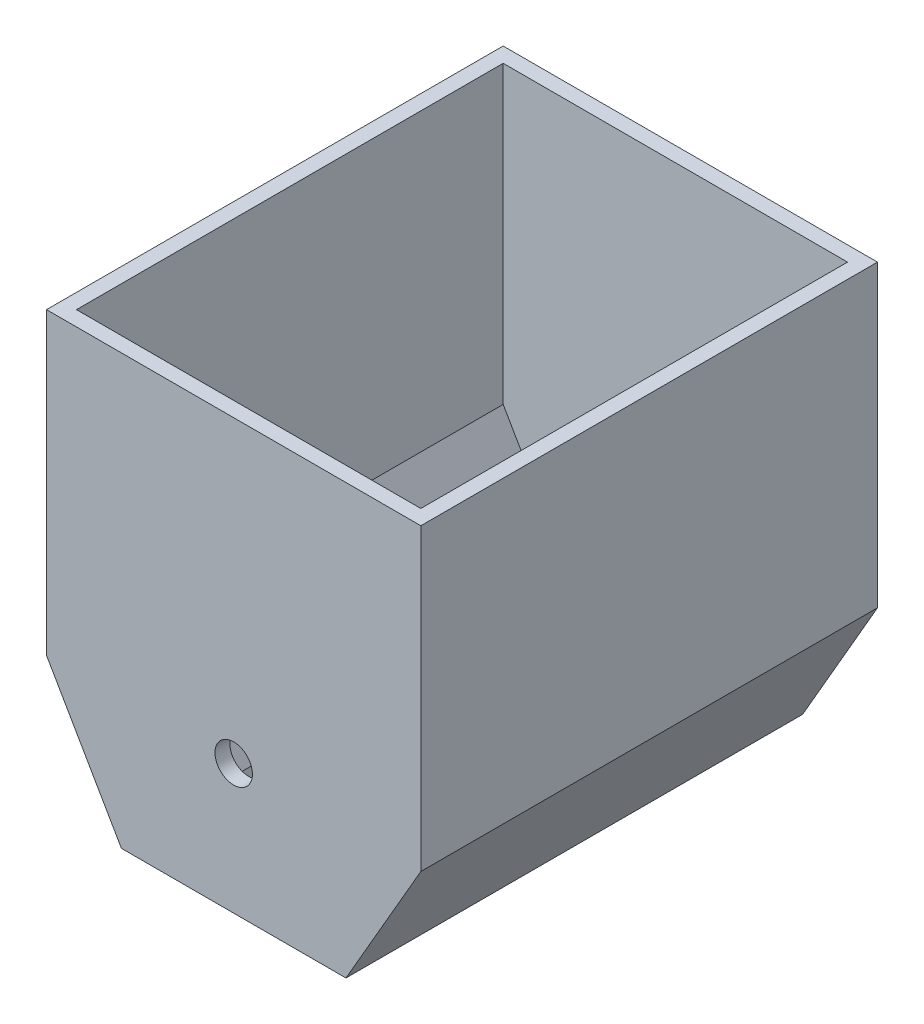
ISO-10303-21;
HEADER;
FILE_DESCRIPTION(('STEP AP214'),'2;1');
FILE_NAME('part.step','',(''),(''),'','','');
FILE_SCHEMA(('AUTOMOTIVE_DESIGN { 1 0 10303 214 1 1 1 1 }'));
ENDSEC;
DATA;
#1=APPLICATION_CONTEXT('core data for automotive mechanical design processes');
#2=APPLICATION_PROTOCOL_DEFINITION('international standard','automotive_design',2000,#1);
#3=PRODUCT_CONTEXT('',#1,'mechanical');
#4=PRODUCT('Part','Part','',(#3));
#5=PRODUCT_RELATED_PRODUCT_CATEGORY('part','',(#4));
#6=PRODUCT_DEFINITION_FORMATION('','',#4);
#7=PRODUCT_DEFINITION_CONTEXT('part definition',#1,'design');
#8=PRODUCT_DEFINITION('design','',#6,#7);
#9=PRODUCT_DEFINITION_SHAPE('','',#8);
#10=(LENGTH_UNIT() NAMED_UNIT(*) SI_UNIT(.MILLI.,.METRE.));
#11=(NAMED_UNIT(*) PLANE_ANGLE_UNIT() SI_UNIT($,.RADIAN.));
#12=(NAMED_UNIT(*) SI_UNIT($,.STERADIAN.) SOLID_ANGLE_UNIT());
#13=UNCERTAINTY_MEASURE_WITH_UNIT(LENGTH_MEASURE(1.E-05),#10,'distance_accuracy_value','');
#14=(GEOMETRIC_REPRESENTATION_CONTEXT(3) GLOBAL_UNCERTAINTY_ASSIGNED_CONTEXT((#13)) GLOBAL_UNIT_ASSIGNED_CONTEXT((#10,
#11,#12)) REPRESENTATION_CONTEXT('',''));
#15=CARTESIAN_POINT('',(0.,0.,0.));
#16=DIRECTION('',(0.,0.,1.));
#17=DIRECTION('',(1.,0.,0.));
#18=AXIS2_PLACEMENT_3D('',#15,#16,#17);
#19=CARTESIAN_POINT('',(31.75,72.7970452561247,38.735));
#20=DIRECTION('',(0.,-1.,0.));
#21=DIRECTION('',(0.,0.,-1.));
#22=AXIS2_PLACEMENT_3D('',#19,#20,#21);
#23=PLANE('',#22);
#24=DIRECTION('',(-1.,0.,0.));
#25=VECTOR('',#24,1.);
#26=CARTESIAN_POINT('',(31.75,72.7970452561247,-38.735));
#27=LINE('',#26,#25);
#28=CARTESIAN_POINT('',(31.75,72.7970452561247,-38.735));
#29=VERTEX_POINT('',#28);
#30=CARTESIAN_POINT('',(-31.75,72.7970452561247,-38.735));
#31=VERTEX_POINT('',#30);
#32=EDGE_CURVE('E229',#29,#31,#27,.T.);
#33=ORIENTED_EDGE('',*,*,#32,.T.);
#34=DIRECTION('',(0.,0.,-1.));
#35=VECTOR('',#34,1.);
#36=CARTESIAN_POINT('',(-31.75,72.7970452561247,38.735));
#37=LINE('',#36,#35);
#38=CARTESIAN_POINT('',(-31.75,72.7970452561247,38.735));
#39=VERTEX_POINT('',#38);
#40=EDGE_CURVE('E44',#39,#31,#37,.T.);
#41=ORIENTED_EDGE('',*,*,#40,.F.);
#42=DIRECTION('',(-1.,0.,0.));
#43=VECTOR('',#42,1.);
#44=CARTESIAN_POINT('',(31.75,72.7970452561247,38.735));
#45=LINE('',#44,#43);
#46=CARTESIAN_POINT('',(31.75,72.7970452561247,38.735));
#47=VERTEX_POINT('',#46);
#48=EDGE_CURVE('E215',#47,#39,#45,.T.);
#49=ORIENTED_EDGE('',*,*,#48,.F.);
#50=DIRECTION('',(0.,0.,-1.));
#51=VECTOR('',#50,1.);
#52=CARTESIAN_POINT('',(31.75,72.7970452561247,38.735));
#53=LINE('',#52,#51);
#54=EDGE_CURVE('E11',#47,#29,#53,.T.);
#55=ORIENTED_EDGE('',*,*,#54,.T.);
#56=EDGE_LOOP('',(#33,#41,#49,#55));
#57=FACE_BOUND('',#56,.T.);
#58=DIRECTION('',(-1.,0.,0.));
#59=VECTOR('',#58,1.);
#60=CARTESIAN_POINT('',(31.75,72.7970452561247,-36.195));
#61=LINE('',#60,#59);
#62=CARTESIAN_POINT('',(29.21,72.7970452561247,-36.195));
#63=VERTEX_POINT('',#62);
#64=CARTESIAN_POINT('',(-29.21,72.7970452561247,-36.195));
#65=VERTEX_POINT('',#64);
#66=EDGE_CURVE('E177',#63,#65,#61,.T.);
#67=ORIENTED_EDGE('',*,*,#66,.F.);
#68=DIRECTION('',(0.,0.,-1.));
#69=VECTOR('',#68,1.);
#70=CARTESIAN_POINT('',(29.21,72.7970452561247,38.735));
#71=LINE('',#70,#69);
#72=CARTESIAN_POINT('',(29.21,72.7970452561247,36.195));
#73=VERTEX_POINT('',#72);
#74=EDGE_CURVE('E204',#73,#63,#71,.T.);
#75=ORIENTED_EDGE('',*,*,#74,.F.);
#76=DIRECTION('',(-1.,0.,0.));
#77=VECTOR('',#76,1.);
#78=CARTESIAN_POINT('',(31.75,72.7970452561247,36.195));
#79=LINE('',#78,#77);
#80=CARTESIAN_POINT('',(-29.21,72.7970452561247,36.195));
#81=VERTEX_POINT('',#80);
#82=EDGE_CURVE('E179',#73,#81,#79,.T.);
#83=ORIENTED_EDGE('',*,*,#82,.T.);
#84=DIRECTION('',(0.,0.,-1.));
#85=VECTOR('',#84,1.);
#86=CARTESIAN_POINT('',(-29.21,72.7970452561247,38.735));
#87=LINE('',#86,#85);
#88=EDGE_CURVE('E201',#81,#65,#87,.T.);
#89=ORIENTED_EDGE('',*,*,#88,.T.);
#90=EDGE_LOOP('',(#67,#75,#83,#89));
#91=FACE_BOUND('',#90,.T.);
#92=ADVANCED_FACE('F35',(#57,#91),#23,.F.);
#93=CARTESIAN_POINT('',(31.75,21.9970452561247,38.735));
#94=DIRECTION('',(-1.,0.,0.));
#95=DIRECTION('',(0.,-1.,0.));
#96=AXIS2_PLACEMENT_3D('',#93,#94,#95);
#97=PLANE('',#96);
#98=DIRECTION('',(0.,1.,0.));
#99=VECTOR('',#98,1.);
#100=CARTESIAN_POINT('',(31.75,21.9970452561247,-38.735));
#101=LINE('',#100,#99);
#102=CARTESIAN_POINT('',(31.75,21.9970452561247,-38.735));
#103=VERTEX_POINT('',#102);
#104=EDGE_CURVE('E206',#103,#29,#101,.T.);
#105=ORIENTED_EDGE('',*,*,#104,.T.);
#106=ORIENTED_EDGE('',*,*,#54,.F.);
#107=DIRECTION('',(0.,1.,0.));
#108=VECTOR('',#107,1.);
#109=CARTESIAN_POINT('',(31.75,21.9970452561247,38.735));
#110=LINE('',#109,#108);
#111=CARTESIAN_POINT('',(31.75,21.9970452561247,38.735));
#112=VERTEX_POINT('',#111);
#113=EDGE_CURVE('E212',#112,#47,#110,.T.);
#114=ORIENTED_EDGE('',*,*,#113,.F.);
#115=DIRECTION('',(0.,0.,-1.));
#116=VECTOR('',#115,1.);
#117=CARTESIAN_POINT('',(31.75,21.9970452561247,38.735));
#118=LINE('',#117,#116);
#119=EDGE_CURVE('E226',#112,#103,#118,.T.);
#120=ORIENTED_EDGE('',*,*,#119,.T.);
#121=EDGE_LOOP('',(#105,#106,#114,#120));
#122=FACE_BOUND('',#121,.T.);
#123=ADVANCED_FACE('F37',(#122),#97,.F.);
#124=CARTESIAN_POINT('',(-31.75,72.7970452561247,38.735));
#125=DIRECTION('',(1.,0.,0.));
#126=DIRECTION('',(0.,0.,-1.));
#127=AXIS2_PLACEMENT_3D('',#124,#125,#126);
#128=PLANE('',#127);
#129=DIRECTION('',(0.,-1.,0.));
#130=VECTOR('',#129,1.);
#131=CARTESIAN_POINT('',(-31.75,72.7970452561247,-38.735));
#132=LINE('',#131,#130);
#133=CARTESIAN_POINT('',(-31.75,21.9970452561247,-38.735));
#134=VERTEX_POINT('',#133);
#135=EDGE_CURVE('E231',#31,#134,#132,.T.);
#136=ORIENTED_EDGE('',*,*,#135,.T.);
#137=DIRECTION('',(0.,0.,-1.));
#138=VECTOR('',#137,1.);
#139=CARTESIAN_POINT('',(-31.75,21.9970452561247,38.735));
#140=LINE('',#139,#138);
#141=CARTESIAN_POINT('',(-31.75,21.9970452561247,38.735));
#142=VERTEX_POINT('',#141);
#143=EDGE_CURVE('E246',#142,#134,#140,.T.);
#144=ORIENTED_EDGE('',*,*,#143,.F.);
#145=DIRECTION('',(0.,-1.,0.));
#146=VECTOR('',#145,1.);
#147=CARTESIAN_POINT('',(-31.75,72.7970452561247,38.735));
#148=LINE('',#147,#146);
#149=EDGE_CURVE('E218',#39,#142,#148,.T.);
#150=ORIENTED_EDGE('',*,*,#149,.F.);
#151=ORIENTED_EDGE('',*,*,#40,.T.);
#152=EDGE_LOOP('',(#136,#144,#150,#151));
#153=FACE_BOUND('',#152,.T.);
#154=ADVANCED_FACE('F254',(#153),#128,.F.);
#155=CARTESIAN_POINT('',(-31.75,21.9970452561247,38.735));
#156=DIRECTION('',(0.866025403784438,0.500000000000001,0.));
#157=DIRECTION('',(-0.500000000000001,0.866025403784438,0.));
#158=AXIS2_PLACEMENT_3D('',#155,#156,#157);
#159=PLANE('',#158);
#160=DIRECTION('',(0.500000000000001,-0.866025403784438,0.));
#161=VECTOR('',#160,1.);
#162=CARTESIAN_POINT('',(-31.75,21.9970452561247,-38.735));
#163=LINE('',#162,#161);
#164=CARTESIAN_POINT('',(-19.05,0.,-38.735));
#165=VERTEX_POINT('',#164);
#166=EDGE_CURVE('E233',#134,#165,#163,.T.);
#167=ORIENTED_EDGE('',*,*,#166,.T.);
#168=DIRECTION('',(0.,0.,-1.));
#169=VECTOR('',#168,1.);
#170=CARTESIAN_POINT('',(-19.05,0.,38.735));
#171=LINE('',#170,#169);
#172=CARTESIAN_POINT('',(-19.05,0.,38.735));
#173=VERTEX_POINT('',#172);
#174=EDGE_CURVE('E243',#173,#165,#171,.T.);
#175=ORIENTED_EDGE('',*,*,#174,.F.);
#176=DIRECTION('',(0.500000000000001,-0.866025403784438,0.));
#177=VECTOR('',#176,1.);
#178=CARTESIAN_POINT('',(-31.75,21.9970452561247,38.735));
#179=LINE('',#178,#177);
#180=EDGE_CURVE('E220',#142,#173,#179,.T.);
#181=ORIENTED_EDGE('',*,*,#180,.F.);
#182=ORIENTED_EDGE('',*,*,#143,.T.);
#183=EDGE_LOOP('',(#167,#175,#181,#182));
#184=FACE_BOUND('',#183,.T.);
#185=ADVANCED_FACE('F265',(#184),#159,.F.);
#186=CARTESIAN_POINT('',(-19.05,0.,38.735));
#187=DIRECTION('',(0.,1.,0.));
#188=DIRECTION('',(-1.,0.,0.));
#189=AXIS2_PLACEMENT_3D('',#186,#187,#188);
#190=PLANE('',#189);
#191=DIRECTION('',(1.,0.,0.));
#192=VECTOR('',#191,1.);
#193=CARTESIAN_POINT('',(-17.5835303162583,0.,36.195));
#194=LINE('',#193,#192);
#195=CARTESIAN_POINT('',(-17.5835303162583,0.,36.195));
#196=VERTEX_POINT('',#195);
#197=CARTESIAN_POINT('',(17.5835303162583,0.,36.195));
#198=VERTEX_POINT('',#197);
#199=EDGE_CURVE('E149',#196,#198,#194,.T.);
#200=ORIENTED_EDGE('',*,*,#199,.T.);
#201=DIRECTION('',(0.,0.,-1.));
#202=VECTOR('',#201,1.);
#203=CARTESIAN_POINT('',(17.5835303162583,0.,-36.195));
#204=LINE('',#203,#202);
#205=CARTESIAN_POINT('',(17.5835303162583,0.,-36.195));
#206=VERTEX_POINT('',#205);
#207=EDGE_CURVE('E142',#198,#206,#204,.T.);
#208=ORIENTED_EDGE('',*,*,#207,.T.);
#209=DIRECTION('',(-1.,0.,0.));
#210=VECTOR('',#209,1.);
#211=CARTESIAN_POINT('',(-17.5835303162583,0.,-36.195));
#212=LINE('',#211,#210);
#213=CARTESIAN_POINT('',(-17.5835303162583,0.,-36.195));
#214=VERTEX_POINT('',#213);
#215=EDGE_CURVE('E152',#206,#214,#212,.T.);
#216=ORIENTED_EDGE('',*,*,#215,.T.);
#217=DIRECTION('',(0.,0.,1.));
#218=VECTOR('',#217,1.);
#219=CARTESIAN_POINT('',(-17.5835303162583,0.,-36.195));
#220=LINE('',#219,#218);
#221=EDGE_CURVE('E51',#214,#196,#220,.T.);
#222=ORIENTED_EDGE('',*,*,#221,.T.);
#223=EDGE_LOOP('',(#200,#208,#216,#222));
#224=FACE_BOUND('',#223,.T.);
#225=DIRECTION('',(1.,0.,0.));
#226=VECTOR('',#225,1.);
#227=CARTESIAN_POINT('',(-19.05,0.,-38.735));
#228=LINE('',#227,#226);
#229=CARTESIAN_POINT('',(19.05,0.,-38.735));
#230=VERTEX_POINT('',#229);
#231=EDGE_CURVE('E235',#165,#230,#228,.T.);
#232=ORIENTED_EDGE('',*,*,#231,.T.);
#233=DIRECTION('',(0.,0.,-1.));
#234=VECTOR('',#233,1.);
#235=CARTESIAN_POINT('',(19.05,0.,38.735));
#236=LINE('',#235,#234);
#237=CARTESIAN_POINT('',(19.05,0.,38.735));
#238=VERTEX_POINT('',#237);
#239=EDGE_CURVE('E240',#238,#230,#236,.T.);
#240=ORIENTED_EDGE('',*,*,#239,.F.);
#241=DIRECTION('',(1.,0.,0.));
#242=VECTOR('',#241,1.);
#243=CARTESIAN_POINT('',(-19.05,0.,38.735));
#244=LINE('',#243,#242);
#245=EDGE_CURVE('E222',#173,#238,#244,.T.);
#246=ORIENTED_EDGE('',*,*,#245,.F.);
#247=ORIENTED_EDGE('',*,*,#174,.T.);
#248=EDGE_LOOP('',(#232,#240,#246,#247));
#249=FACE_BOUND('',#248,.T.);
#250=ADVANCED_FACE('F158',(#224,#249),#190,.F.);
#251=CARTESIAN_POINT('',(19.05,0.,38.735));
#252=DIRECTION('',(-0.866025403784438,0.500000000000001,0.));
#253=DIRECTION('',(-0.500000000000001,-0.866025403784438,0.));
#254=AXIS2_PLACEMENT_3D('',#251,#252,#253);
#255=PLANE('',#254);
#256=DIRECTION('',(0.500000000000001,0.866025403784438,0.));
#257=VECTOR('',#256,1.);
#258=CARTESIAN_POINT('',(19.05,0.,-38.735));
#259=LINE('',#258,#257);
#260=EDGE_CURVE('E216',#230,#103,#259,.T.);
#261=ORIENTED_EDGE('',*,*,#260,.T.);
#262=ORIENTED_EDGE('',*,*,#119,.F.);
#263=DIRECTION('',(0.500000000000001,0.866025403784438,0.));
#264=VECTOR('',#263,1.);
#265=CARTESIAN_POINT('',(19.05,0.,38.735));
#266=LINE('',#265,#264);
#267=EDGE_CURVE('E224',#238,#112,#266,.T.);
#268=ORIENTED_EDGE('',*,*,#267,.F.);
#269=ORIENTED_EDGE('',*,*,#239,.T.);
#270=EDGE_LOOP('',(#261,#262,#268,#269));
#271=FACE_BOUND('',#270,.T.);
#272=ADVANCED_FACE('F278',(#271),#255,.F.);
#273=CARTESIAN_POINT('',(0.,0.,38.735));
#274=DIRECTION('',(0.,0.,1.));
#275=DIRECTION('',(1.,0.,0.));
#276=AXIS2_PLACEMENT_3D('',#273,#274,#275);
#277=PLANE('',#276);
#278=CARTESIAN_POINT('',(0.,21.9970452561247,38.735));
#279=DIRECTION('',(0.,0.,1.));
#280=DIRECTION('',(1.,0.,0.));
#281=AXIS2_PLACEMENT_3D('',#278,#279,#280);
#282=CIRCLE('',#281,3.175);
#283=CARTESIAN_POINT('',(3.17499999999999,21.9970452561247,38.735));
#284=VERTEX_POINT('',#283);
#285=EDGE_CURVE('E161',#284,#284,#282,.T.);
#286=ORIENTED_EDGE('',*,*,#285,.F.);
#287=EDGE_LOOP('',(#286));
#288=FACE_BOUND('',#287,.T.);
#289=ORIENTED_EDGE('',*,*,#113,.T.);
#290=ORIENTED_EDGE('',*,*,#48,.T.);
#291=ORIENTED_EDGE('',*,*,#149,.T.);
#292=ORIENTED_EDGE('',*,*,#180,.T.);
#293=ORIENTED_EDGE('',*,*,#245,.T.);
#294=ORIENTED_EDGE('',*,*,#267,.T.);
#295=EDGE_LOOP('',(#289,#290,#291,#292,#293,#294));
#296=FACE_BOUND('',#295,.T.);
#297=ADVANCED_FACE('F271',(#288,#296),#277,.T.);
#298=CARTESIAN_POINT('',(0.,0.,-38.735));
#299=DIRECTION('',(0.,0.,1.));
#300=DIRECTION('',(1.,0.,0.));
#301=AXIS2_PLACEMENT_3D('',#298,#299,#300);
#302=PLANE('',#301);
#303=CARTESIAN_POINT('',(0.,21.9970452561247,-38.735));
#304=DIRECTION('',(0.,0.,1.));
#305=DIRECTION('',(1.,0.,0.));
#306=AXIS2_PLACEMENT_3D('',#303,#304,#305);
#307=CIRCLE('',#306,3.175);
#308=CARTESIAN_POINT('',(3.17499999999999,21.9970452561247,-38.735));
#309=VERTEX_POINT('',#308);
#310=EDGE_CURVE('E455',#309,#309,#307,.T.);
#311=ORIENTED_EDGE('',*,*,#310,.T.);
#312=EDGE_LOOP('',(#311));
#313=FACE_BOUND('',#312,.T.);
#314=ORIENTED_EDGE('',*,*,#104,.F.);
#315=ORIENTED_EDGE('',*,*,#260,.F.);
#316=ORIENTED_EDGE('',*,*,#231,.F.);
#317=ORIENTED_EDGE('',*,*,#166,.F.);
#318=ORIENTED_EDGE('',*,*,#135,.F.);
#319=ORIENTED_EDGE('',*,*,#32,.F.);
#320=EDGE_LOOP('',(#314,#315,#316,#317,#318,#319));
#321=FACE_BOUND('',#320,.T.);
#322=ADVANCED_FACE('F260',(#313,#321),#302,.F.);
#323=CARTESIAN_POINT('',(29.21,21.9970452561247,38.735));
#324=DIRECTION('',(-1.,0.,0.));
#325=DIRECTION('',(0.,-1.,0.));
#326=AXIS2_PLACEMENT_3D('',#323,#324,#325);
#327=PLANE('',#326);
#328=DIRECTION('',(0.,1.,0.));
#329=VECTOR('',#328,1.);
#330=CARTESIAN_POINT('',(29.21,21.9970452561247,-36.195));
#331=LINE('',#330,#329);
#332=CARTESIAN_POINT('',(29.21,22.6776362048998,-36.195));
#333=VERTEX_POINT('',#332);
#334=EDGE_CURVE('E172',#333,#63,#331,.T.);
#335=ORIENTED_EDGE('',*,*,#334,.F.);
#336=DIRECTION('',(0.,0.,-1.));
#337=VECTOR('',#336,1.);
#338=CARTESIAN_POINT('',(29.21,22.6776362048998,38.735));
#339=LINE('',#338,#337);
#340=CARTESIAN_POINT('',(29.21,22.6776362048998,36.195));
#341=VERTEX_POINT('',#340);
#342=EDGE_CURVE('E181',#341,#333,#339,.T.);
#343=ORIENTED_EDGE('',*,*,#342,.F.);
#344=DIRECTION('',(0.,1.,0.));
#345=VECTOR('',#344,1.);
#346=CARTESIAN_POINT('',(29.21,21.9970452561247,36.195));
#347=LINE('',#346,#345);
#348=EDGE_CURVE('E59',#341,#73,#347,.T.);
#349=ORIENTED_EDGE('',*,*,#348,.T.);
#350=ORIENTED_EDGE('',*,*,#74,.T.);
#351=EDGE_LOOP('',(#335,#343,#349,#350));
#352=FACE_BOUND('',#351,.T.);
#353=ADVANCED_FACE('F372',(#352),#327,.T.);
#354=CARTESIAN_POINT('',(-29.21,72.7970452561247,38.735));
#355=DIRECTION('',(1.,0.,0.));
#356=DIRECTION('',(0.,0.,-1.));
#357=AXIS2_PLACEMENT_3D('',#354,#355,#356);
#358=PLANE('',#357);
#359=DIRECTION('',(0.,-1.,0.));
#360=VECTOR('',#359,1.);
#361=CARTESIAN_POINT('',(-29.21,72.7970452561247,-36.195));
#362=LINE('',#361,#360);
#363=CARTESIAN_POINT('',(-29.21,22.6776362048998,-36.195));
#364=VERTEX_POINT('',#363);
#365=EDGE_CURVE('E195',#65,#364,#362,.T.);
#366=ORIENTED_EDGE('',*,*,#365,.F.);
#367=ORIENTED_EDGE('',*,*,#88,.F.);
#368=DIRECTION('',(0.,-1.,0.));
#369=VECTOR('',#368,1.);
#370=CARTESIAN_POINT('',(-29.21,72.7970452561247,36.195));
#371=LINE('',#370,#369);
#372=CARTESIAN_POINT('',(-29.21,22.6776362048998,36.195));
#373=VERTEX_POINT('',#372);
#374=EDGE_CURVE('E198',#81,#373,#371,.T.);
#375=ORIENTED_EDGE('',*,*,#374,.T.);
#376=DIRECTION('',(0.,0.,-1.));
#377=VECTOR('',#376,1.);
#378=CARTESIAN_POINT('',(-29.21,22.6776362048998,38.735));
#379=LINE('',#378,#377);
#380=EDGE_CURVE('E193',#373,#364,#379,.T.);
#381=ORIENTED_EDGE('',*,*,#380,.T.);
#382=EDGE_LOOP('',(#366,#367,#375,#381));
#383=FACE_BOUND('',#382,.T.);
#384=ADVANCED_FACE('F312',(#383),#358,.T.);
#385=CARTESIAN_POINT('',(-29.5502954743875,23.2670452561247,38.735));
#386=DIRECTION('',(0.866025403784438,0.500000000000001,0.));
#387=DIRECTION('',(-0.500000000000001,0.866025403784438,0.));
#388=AXIS2_PLACEMENT_3D('',#385,#386,#387);
#389=PLANE('',#388);
#390=DIRECTION('',(0.500000000000001,-0.866025403784438,0.));
#391=VECTOR('',#390,1.);
#392=CARTESIAN_POINT('',(-29.5502954743875,23.2670452561247,-36.195));
#393=LINE('',#392,#391);
#394=CARTESIAN_POINT('',(-17.5835303162583,2.53999999999999,-36.195));
#395=VERTEX_POINT('',#394);
#396=EDGE_CURVE('E186',#364,#395,#393,.T.);
#397=ORIENTED_EDGE('',*,*,#396,.F.);
#398=ORIENTED_EDGE('',*,*,#380,.F.);
#399=DIRECTION('',(0.500000000000001,-0.866025403784438,0.));
#400=VECTOR('',#399,1.);
#401=CARTESIAN_POINT('',(-29.5502954743875,23.2670452561247,36.195));
#402=LINE('',#401,#400);
#403=CARTESIAN_POINT('',(-17.5835303162583,2.53999999999999,36.195));
#404=VERTEX_POINT('',#403);
#405=EDGE_CURVE('E188',#373,#404,#402,.T.);
#406=ORIENTED_EDGE('',*,*,#405,.T.);
#407=DIRECTION('',(0.,0.,-1.));
#408=VECTOR('',#407,1.);
#409=CARTESIAN_POINT('',(-17.5835303162583,2.53999999999999,38.735));
#410=LINE('',#409,#408);
#411=EDGE_CURVE('E190',#404,#395,#410,.T.);
#412=ORIENTED_EDGE('',*,*,#411,.T.);
#413=EDGE_LOOP('',(#397,#398,#406,#412));
#414=FACE_BOUND('',#413,.T.);
#415=ADVANCED_FACE('F317',(#414),#389,.T.);
#416=CARTESIAN_POINT('',(16.8502954743875,1.26999999999999,38.735));
#417=DIRECTION('',(-0.866025403784438,0.500000000000001,0.));
#418=DIRECTION('',(-0.500000000000001,-0.866025403784438,0.));
#419=AXIS2_PLACEMENT_3D('',#416,#417,#418);
#420=PLANE('',#419);
#421=DIRECTION('',(0.500000000000001,0.866025403784438,0.));
#422=VECTOR('',#421,1.);
#423=CARTESIAN_POINT('',(16.8502954743875,1.26999999999999,-36.195));
#424=LINE('',#423,#422);
#425=CARTESIAN_POINT('',(17.5835303162583,2.53999999999998,-36.195));
#426=VERTEX_POINT('',#425);
#427=EDGE_CURVE('E180',#426,#333,#424,.T.);
#428=ORIENTED_EDGE('',*,*,#427,.F.);
#429=DIRECTION('',(0.,0.,-1.));
#430=VECTOR('',#429,1.);
#431=CARTESIAN_POINT('',(17.5835303162583,2.53999999999999,38.735));
#432=LINE('',#431,#430);
#433=CARTESIAN_POINT('',(17.5835303162583,2.53999999999999,36.195));
#434=VERTEX_POINT('',#433);
#435=EDGE_CURVE('E145',#434,#426,#432,.T.);
#436=ORIENTED_EDGE('',*,*,#435,.F.);
#437=DIRECTION('',(0.500000000000001,0.866025403784438,0.));
#438=VECTOR('',#437,1.);
#439=CARTESIAN_POINT('',(16.8502954743875,1.26999999999999,36.195));
#440=LINE('',#439,#438);
#441=EDGE_CURVE('E184',#434,#341,#440,.T.);
#442=ORIENTED_EDGE('',*,*,#441,.T.);
#443=ORIENTED_EDGE('',*,*,#342,.T.);
#444=EDGE_LOOP('',(#428,#436,#442,#443));
#445=FACE_BOUND('',#444,.T.);
#446=ADVANCED_FACE('F322',(#445),#420,.T.);
#447=CARTESIAN_POINT('',(0.,0.,36.195));
#448=DIRECTION('',(0.,0.,1.));
#449=DIRECTION('',(1.,0.,0.));
#450=AXIS2_PLACEMENT_3D('',#447,#448,#449);
#451=PLANE('',#450);
#452=CARTESIAN_POINT('',(0.,21.9970452561247,36.195));
#453=DIRECTION('',(0.,0.,1.));
#454=DIRECTION('',(1.,0.,0.));
#455=AXIS2_PLACEMENT_3D('',#452,#453,#454);
#456=CIRCLE('',#455,3.175);
#457=CARTESIAN_POINT('',(3.17499999999999,21.9970452561247,36.195));
#458=VERTEX_POINT('',#457);
#459=EDGE_CURVE('E164',#458,#458,#456,.T.);
#460=ORIENTED_EDGE('',*,*,#459,.T.);
#461=EDGE_LOOP('',(#460));
#462=FACE_BOUND('',#461,.T.);
#463=ORIENTED_EDGE('',*,*,#348,.F.);
#464=ORIENTED_EDGE('',*,*,#441,.F.);
#465=DIRECTION('',(0.,1.,0.));
#466=VECTOR('',#465,1.);
#467=CARTESIAN_POINT('',(17.5835303162583,0.,36.195));
#468=LINE('',#467,#466);
#469=EDGE_CURVE('E170',#198,#434,#468,.T.);
#470=ORIENTED_EDGE('',*,*,#469,.F.);
#471=ORIENTED_EDGE('',*,*,#199,.F.);
#472=DIRECTION('',(0.,1.,0.));
#473=VECTOR('',#472,1.);
#474=CARTESIAN_POINT('',(-17.5835303162583,0.,36.195));
#475=LINE('',#474,#473);
#476=EDGE_CURVE('E173',#196,#404,#475,.T.);
#477=ORIENTED_EDGE('',*,*,#476,.T.);
#478=ORIENTED_EDGE('',*,*,#405,.F.);
#479=ORIENTED_EDGE('',*,*,#374,.F.);
#480=ORIENTED_EDGE('',*,*,#82,.F.);
#481=EDGE_LOOP('',(#463,#464,#470,#471,#477,#478,#479,#480));
#482=FACE_BOUND('',#481,.T.);
#483=ADVANCED_FACE('F332',(#462,#482),#451,.F.);
#484=CARTESIAN_POINT('',(0.,0.,-36.195));
#485=DIRECTION('',(0.,0.,1.));
#486=DIRECTION('',(1.,0.,0.));
#487=AXIS2_PLACEMENT_3D('',#484,#485,#486);
#488=PLANE('',#487);
#489=CARTESIAN_POINT('',(0.,21.9970452561247,-36.195));
#490=DIRECTION('',(0.,0.,1.));
#491=DIRECTION('',(1.,0.,0.));
#492=AXIS2_PLACEMENT_3D('',#489,#490,#491);
#493=CIRCLE('',#492,3.175);
#494=CARTESIAN_POINT('',(3.17499999999999,21.9970452561247,-36.195));
#495=VERTEX_POINT('',#494);
#496=EDGE_CURVE('E39',#495,#495,#493,.T.);
#497=ORIENTED_EDGE('',*,*,#496,.F.);
#498=EDGE_LOOP('',(#497));
#499=FACE_BOUND('',#498,.T.);
#500=ORIENTED_EDGE('',*,*,#334,.T.);
#501=ORIENTED_EDGE('',*,*,#66,.T.);
#502=ORIENTED_EDGE('',*,*,#365,.T.);
#503=ORIENTED_EDGE('',*,*,#396,.T.);
#504=DIRECTION('',(0.,1.,0.));
#505=VECTOR('',#504,1.);
#506=CARTESIAN_POINT('',(-17.5835303162583,0.,-36.195));
#507=LINE('',#506,#505);
#508=EDGE_CURVE('E148',#214,#395,#507,.T.);
#509=ORIENTED_EDGE('',*,*,#508,.F.);
#510=ORIENTED_EDGE('',*,*,#215,.F.);
#511=DIRECTION('',(0.,1.,0.));
#512=VECTOR('',#511,1.);
#513=CARTESIAN_POINT('',(17.5835303162583,0.,-36.195));
#514=LINE('',#513,#512);
#515=EDGE_CURVE('E138',#206,#426,#514,.T.);
#516=ORIENTED_EDGE('',*,*,#515,.T.);
#517=ORIENTED_EDGE('',*,*,#427,.T.);
#518=EDGE_LOOP('',(#500,#501,#502,#503,#509,#510,#516,#517));
#519=FACE_BOUND('',#518,.T.);
#520=ADVANCED_FACE('F154',(#499,#519),#488,.T.);
#521=CARTESIAN_POINT('',(17.5835303162583,0.,-36.195));
#522=DIRECTION('',(1.,0.,0.));
#523=DIRECTION('',(0.,1.,0.));
#524=AXIS2_PLACEMENT_3D('',#521,#522,#523);
#525=PLANE('',#524);
#526=ORIENTED_EDGE('',*,*,#435,.T.);
#527=ORIENTED_EDGE('',*,*,#515,.F.);
#528=ORIENTED_EDGE('',*,*,#207,.F.);
#529=ORIENTED_EDGE('',*,*,#469,.T.);
#530=EDGE_LOOP('',(#526,#527,#528,#529));
#531=FACE_BOUND('',#530,.T.);
#532=ADVANCED_FACE('F140',(#531),#525,.F.);
#533=CARTESIAN_POINT('',(-17.5835303162583,0.,-36.195));
#534=DIRECTION('',(-1.,0.,0.));
#535=DIRECTION('',(0.,-1.,0.));
#536=AXIS2_PLACEMENT_3D('',#533,#534,#535);
#537=PLANE('',#536);
#538=ORIENTED_EDGE('',*,*,#411,.F.);
#539=ORIENTED_EDGE('',*,*,#476,.F.);
#540=ORIENTED_EDGE('',*,*,#221,.F.);
#541=ORIENTED_EDGE('',*,*,#508,.T.);
#542=EDGE_LOOP('',(#538,#539,#540,#541));
#543=FACE_BOUND('',#542,.T.);
#544=ADVANCED_FACE('F344',(#543),#537,.F.);
#545=CARTESIAN_POINT('',(0.,21.9970452561247,-38.735));
#546=DIRECTION('',(0.,0.,1.));
#547=DIRECTION('',(1.,0.,0.));
#548=AXIS2_PLACEMENT_3D('',#545,#546,#547);
#549=CYLINDRICAL_SURFACE('',#548,3.175);
#550=ORIENTED_EDGE('',*,*,#496,.T.);
#551=EDGE_LOOP('',(#550));
#552=FACE_BOUND('',#551,.T.);
#553=ORIENTED_EDGE('',*,*,#310,.F.);
#554=EDGE_LOOP('',(#553));
#555=FACE_BOUND('',#554,.T.);
#556=ADVANCED_FACE('F355',(#552,#555),#549,.F.);
#557=ORIENTED_EDGE('',*,*,#285,.T.);
#558=EDGE_LOOP('',(#557));
#559=FACE_BOUND('',#558,.T.);
#560=ORIENTED_EDGE('',*,*,#459,.F.);
#561=EDGE_LOOP('',(#560));
#562=FACE_BOUND('',#561,.T.);
#563=ADVANCED_FACE('F397',(#559,#562),#549,.F.);
#564=CLOSED_SHELL('',(#92,#123,#154,#185,#250,#272,#297,#322,#353,#384,#415,#446,#483,#520,#532,
#544,#556,#563));
#565=MANIFOLD_SOLID_BREP('B2',#564);
#566=ADVANCED_BREP_SHAPE_REPRESENTATION('',(#18,#565),#14);
#567=SHAPE_DEFINITION_REPRESENTATION(#9,#566);
ENDSEC;
END-ISO-10303-21;
